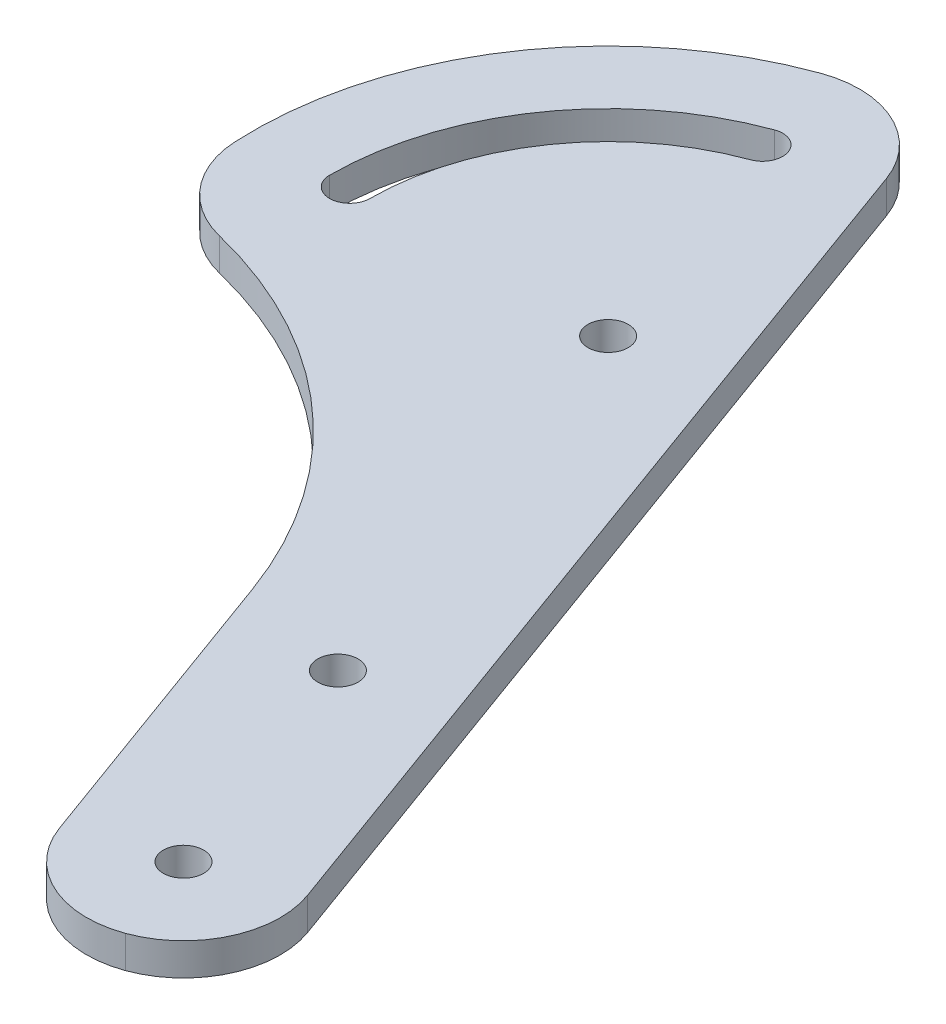
ISO-10303-21;
HEADER;
FILE_DESCRIPTION(('STEP AP214'),'2;1');
FILE_NAME('part.step','',(''),(''),'','','');
FILE_SCHEMA(('AUTOMOTIVE_DESIGN { 1 0 10303 214 1 1 1 1 }'));
ENDSEC;
DATA;
#1=APPLICATION_CONTEXT('core data for automotive mechanical design processes');
#2=APPLICATION_PROTOCOL_DEFINITION('international standard','automotive_design',2000,#1);
#3=PRODUCT_CONTEXT('',#1,'mechanical');
#4=PRODUCT('Part','Part','',(#3));
#5=PRODUCT_RELATED_PRODUCT_CATEGORY('part','',(#4));
#6=PRODUCT_DEFINITION_FORMATION('','',#4);
#7=PRODUCT_DEFINITION_CONTEXT('part definition',#1,'design');
#8=PRODUCT_DEFINITION('design','',#6,#7);
#9=PRODUCT_DEFINITION_SHAPE('','',#8);
#10=(LENGTH_UNIT() NAMED_UNIT(*) SI_UNIT(.MILLI.,.METRE.));
#11=(NAMED_UNIT(*) PLANE_ANGLE_UNIT() SI_UNIT($,.RADIAN.));
#12=(NAMED_UNIT(*) SI_UNIT($,.STERADIAN.) SOLID_ANGLE_UNIT());
#13=UNCERTAINTY_MEASURE_WITH_UNIT(LENGTH_MEASURE(1.E-05),#10,'distance_accuracy_value','');
#14=(GEOMETRIC_REPRESENTATION_CONTEXT(3) GLOBAL_UNCERTAINTY_ASSIGNED_CONTEXT((#13)) GLOBAL_UNIT_ASSIGNED_CONTEXT((#10,
#11,#12)) REPRESENTATION_CONTEXT('',''));
#15=CARTESIAN_POINT('',(0.,0.,0.));
#16=DIRECTION('',(0.,0.,1.));
#17=DIRECTION('',(1.,0.,0.));
#18=AXIS2_PLACEMENT_3D('',#15,#16,#17);
#19=CARTESIAN_POINT('',(152.4,6.35,-19.05));
#20=DIRECTION('',(0.,1.,0.));
#21=DIRECTION('',(0.,0.,1.));
#22=AXIS2_PLACEMENT_3D('',#19,#20,#21);
#23=PLANE('',#22);
#24=CARTESIAN_POINT('',(152.4,6.35,-19.05));
#25=DIRECTION('',(0.,1.,0.));
#26=DIRECTION('',(0.,0.,1.));
#27=AXIS2_PLACEMENT_3D('',#24,#25,#26);
#28=CIRCLE('',#27,3.96874999999999);
#29=CARTESIAN_POINT('',(152.4,6.35,-15.08125));
#30=VERTEX_POINT('',#29);
#31=EDGE_CURVE('E248',#30,#30,#28,.T.);
#32=ORIENTED_EDGE('',*,*,#31,.F.);
#33=EDGE_LOOP('',(#32));
#34=FACE_BOUND('',#33,.T.);
#35=CARTESIAN_POINT('',(182.805590741652,6.35,64.4886739878671));
#36=DIRECTION('',(0.,1.,0.));
#37=DIRECTION('',(0.,0.,1.));
#38=AXIS2_PLACEMENT_3D('',#35,#36,#37);
#39=CIRCLE('',#38,3.96874999999999);
#40=CARTESIAN_POINT('',(182.805590741652,6.35,68.4574239878671));
#41=VERTEX_POINT('',#40);
#42=EDGE_CURVE('E255',#41,#41,#39,.T.);
#43=ORIENTED_EDGE('',*,*,#42,.F.);
#44=EDGE_LOOP('',(#43));
#45=FACE_BOUND('',#44,.T.);
#46=CARTESIAN_POINT('',(200.180214022596,6.35,112.225059123791));
#47=DIRECTION('',(0.,1.,0.));
#48=DIRECTION('',(0.,0.,1.));
#49=AXIS2_PLACEMENT_3D('',#46,#47,#48);
#50=CIRCLE('',#49,3.96874999999999);
#51=CARTESIAN_POINT('',(200.180214022596,6.35,116.193809123791));
#52=VERTEX_POINT('',#51);
#53=EDGE_CURVE('E263',#52,#52,#50,.T.);
#54=ORIENTED_EDGE('',*,*,#53,.F.);
#55=EDGE_LOOP('',(#54));
#56=FACE_BOUND('',#55,.T.);
#57=DIRECTION('',(-0.342020143325673,0.,-0.939692620785907));
#58=VECTOR('',#57,1.);
#59=CARTESIAN_POINT('',(224.596842178922,6.35,123.610719819409));
#60=LINE('',#59,#58);
#61=CARTESIAN_POINT('',(218.081358448568,6.35,105.709575393437));
#62=VERTEX_POINT('',#61);
#63=CARTESIAN_POINT('',(152.926521145027,6.35,-73.3018688662781));
#64=VERTEX_POINT('',#63);
#65=EDGE_CURVE('E174',#62,#64,#60,.T.);
#66=ORIENTED_EDGE('',*,*,#65,.T.);
#67=CARTESIAN_POINT('',(135.025376719056,6.35,-66.7863851359241));
#68=DIRECTION('',(0.,1.,0.));
#69=DIRECTION('',(0.,0.,1.));
#70=AXIS2_PLACEMENT_3D('',#67,#68,#69);
#71=CIRCLE('',#70,19.05);
#72=CARTESIAN_POINT('',(128.509892988702,6.35,-84.6875295618957));
#73=VERTEX_POINT('',#72);
#74=EDGE_CURVE('E219',#64,#73,#71,.T.);
#75=ORIENTED_EDGE('',*,*,#74,.T.);
#76=CARTESIAN_POINT('',(152.4,6.35,-19.05));
#77=DIRECTION('',(0.,1.,0.));
#78=DIRECTION('',(0.,0.,1.));
#79=AXIS2_PLACEMENT_3D('',#76,#77,#78);
#80=CIRCLE('',#79,69.85);
#81=CARTESIAN_POINT('',(82.6455226381116,6.35,-15.3982349514504));
#82=VERTEX_POINT('',#81);
#83=EDGE_CURVE('E177',#73,#82,#80,.T.);
#84=ORIENTED_EDGE('',*,*,#83,.T.);
#85=CARTESIAN_POINT('',(101.669471009536,6.35,-16.3941708737821));
#86=DIRECTION('',(0.,1.,0.));
#87=DIRECTION('',(0.,0.,1.));
#88=AXIS2_PLACEMENT_3D('',#85,#86,#87);
#89=CIRCLE('',#88,19.05);
#90=CARTESIAN_POINT('',(97.1129181675343,6.35,2.10286473190478));
#91=VERTEX_POINT('',#90);
#92=EDGE_CURVE('E214',#82,#91,#89,.T.);
#93=ORIENTED_EDGE('',*,*,#92,.T.);
#94=CARTESIAN_POINT('',(75.4484422519158,6.35,90.0484227633844));
#95=DIRECTION('',(0.,-1.,0.));
#96=DIRECTION('',(0.,0.,-1.));
#97=AXIS2_PLACEMENT_3D('',#94,#95,#96);
#98=CIRCLE('',#97,90.5746691639929);
#99=CARTESIAN_POINT('',(160.560790495445,6.35,59.0700614342402));
#100=VERTEX_POINT('',#99);
#101=EDGE_CURVE('E181',#91,#100,#98,.T.);
#102=ORIENTED_EDGE('',*,*,#101,.T.);
#103=DIRECTION('',(0.342020143325673,0.,0.939692620785907));
#104=VECTOR('',#103,1.);
#105=CARTESIAN_POINT('',(160.560790495445,6.35,59.0700614342402));
#106=LINE('',#105,#104);
#107=CARTESIAN_POINT('',(182.279069596625,6.35,118.740542854145));
#108=VERTEX_POINT('',#107);
#109=EDGE_CURVE('E183',#100,#108,#106,.T.);
#110=ORIENTED_EDGE('',*,*,#109,.T.);
#111=CARTESIAN_POINT('',(200.180214022596,6.35,112.225059123791));
#112=DIRECTION('',(0.,1.,0.));
#113=DIRECTION('',(0.,0.,1.));
#114=AXIS2_PLACEMENT_3D('',#111,#112,#113);
#115=CIRCLE('',#114,19.05);
#116=CARTESIAN_POINT('',(206.695697752951,6.35,130.126203549763));
#117=VERTEX_POINT('',#116);
#118=EDGE_CURVE('E55',#108,#117,#115,.T.);
#119=ORIENTED_EDGE('',*,*,#118,.T.);
#120=CARTESIAN_POINT('',(200.180214022596,6.35,112.225059123791));
#121=DIRECTION('',(0.,1.,0.));
#122=DIRECTION('',(0.,0.,1.));
#123=AXIS2_PLACEMENT_3D('',#120,#121,#122);
#124=CIRCLE('',#123,19.05);
#125=EDGE_CURVE('E217',#117,#62,#124,.T.);
#126=ORIENTED_EDGE('',*,*,#125,.T.);
#127=EDGE_LOOP('',(#66,#75,#84,#93,#102,#110,#119,#126));
#128=FACE_BOUND('',#127,.T.);
#129=CARTESIAN_POINT('',(152.4,6.35,-19.05));
#130=DIRECTION('',(0.,-1.,0.));
#131=DIRECTION('',(0.,0.,-1.));
#132=AXIS2_PLACEMENT_3D('',#129,#130,#131);
#133=CIRCLE('',#132,46.83125);
#134=CARTESIAN_POINT('',(105.56875,6.35,-19.05));
#135=VERTEX_POINT('',#134);
#136=CARTESIAN_POINT('',(136.38276916288,6.35,-63.05698004718));
#137=VERTEX_POINT('',#136);
#138=EDGE_CURVE('E141',#135,#137,#133,.T.);
#139=ORIENTED_EDGE('',*,*,#138,.F.);
#140=CARTESIAN_POINT('',(101.6,6.35,-19.05));
#141=DIRECTION('',(0.,1.,0.));
#142=DIRECTION('',(0.,0.,-1.));
#143=AXIS2_PLACEMENT_3D('',#140,#141,#142);
#144=CIRCLE('',#143,3.96874999999999);
#145=CARTESIAN_POINT('',(97.63125,6.35,-19.05));
#146=VERTEX_POINT('',#145);
#147=EDGE_CURVE('E131',#146,#135,#144,.T.);
#148=ORIENTED_EDGE('',*,*,#147,.F.);
#149=CARTESIAN_POINT('',(152.4,6.35,-19.05));
#150=DIRECTION('',(0.,1.,0.));
#151=DIRECTION('',(0.,0.,-1.));
#152=AXIS2_PLACEMENT_3D('',#149,#150,#151);
#153=CIRCLE('',#152,54.76875);
#154=CARTESIAN_POINT('',(133.667984275232,6.35,-70.5157902246681));
#155=VERTEX_POINT('',#154);
#156=EDGE_CURVE('E156',#155,#146,#153,.T.);
#157=ORIENTED_EDGE('',*,*,#156,.F.);
#158=CARTESIAN_POINT('',(135.025376719056,6.35,-66.786385135924));
#159=DIRECTION('',(0.,1.,0.));
#160=DIRECTION('',(0.,0.,1.));
#161=AXIS2_PLACEMENT_3D('',#158,#159,#160);
#162=CIRCLE('',#161,3.96874999999999);
#163=EDGE_CURVE('E154',#137,#155,#162,.T.);
#164=ORIENTED_EDGE('',*,*,#163,.F.);
#165=EDGE_LOOP('',(#139,#148,#157,#164));
#166=FACE_BOUND('',#165,.T.);
#167=ADVANCED_FACE('F39',(#34,#45,#56,#128,#166),#23,.T.);
#168=CARTESIAN_POINT('',(152.4,0.,-19.05));
#169=DIRECTION('',(0.,1.,0.));
#170=DIRECTION('',(0.,0.,1.));
#171=AXIS2_PLACEMENT_3D('',#168,#169,#170);
#172=PLANE('',#171);
#173=CARTESIAN_POINT('',(152.4,0.,-19.05));
#174=DIRECTION('',(0.,1.,0.));
#175=DIRECTION('',(0.,0.,1.));
#176=AXIS2_PLACEMENT_3D('',#173,#174,#175);
#177=CIRCLE('',#176,3.96874999999999);
#178=CARTESIAN_POINT('',(152.4,0.,-15.08125));
#179=VERTEX_POINT('',#178);
#180=EDGE_CURVE('E250',#179,#179,#177,.T.);
#181=ORIENTED_EDGE('',*,*,#180,.T.);
#182=EDGE_LOOP('',(#181));
#183=FACE_BOUND('',#182,.T.);
#184=CARTESIAN_POINT('',(182.805590741652,0.,64.4886739878671));
#185=DIRECTION('',(0.,1.,0.));
#186=DIRECTION('',(0.,0.,1.));
#187=AXIS2_PLACEMENT_3D('',#184,#185,#186);
#188=CIRCLE('',#187,3.96874999999999);
#189=CARTESIAN_POINT('',(182.805590741652,0.,68.4574239878671));
#190=VERTEX_POINT('',#189);
#191=EDGE_CURVE('E260',#190,#190,#188,.T.);
#192=ORIENTED_EDGE('',*,*,#191,.T.);
#193=EDGE_LOOP('',(#192));
#194=FACE_BOUND('',#193,.T.);
#195=CARTESIAN_POINT('',(200.180214022596,0.,112.225059123791));
#196=DIRECTION('',(0.,1.,0.));
#197=DIRECTION('',(0.,0.,1.));
#198=AXIS2_PLACEMENT_3D('',#195,#196,#197);
#199=CIRCLE('',#198,3.96874999999999);
#200=CARTESIAN_POINT('',(200.180214022596,0.,116.193809123791));
#201=VERTEX_POINT('',#200);
#202=EDGE_CURVE('E163',#201,#201,#199,.T.);
#203=ORIENTED_EDGE('',*,*,#202,.T.);
#204=EDGE_LOOP('',(#203));
#205=FACE_BOUND('',#204,.T.);
#206=CARTESIAN_POINT('',(152.4,0.,-19.05));
#207=DIRECTION('',(0.,1.,0.));
#208=DIRECTION('',(0.,0.,1.));
#209=AXIS2_PLACEMENT_3D('',#206,#207,#208);
#210=CIRCLE('',#209,69.85);
#211=CARTESIAN_POINT('',(128.509892988702,0.,-84.6875295618957));
#212=VERTEX_POINT('',#211);
#213=CARTESIAN_POINT('',(82.6455226381116,0.,-15.3982349514504));
#214=VERTEX_POINT('',#213);
#215=EDGE_CURVE('E188',#212,#214,#210,.T.);
#216=ORIENTED_EDGE('',*,*,#215,.F.);
#217=CARTESIAN_POINT('',(135.025376719056,0.,-66.7863851359241));
#218=DIRECTION('',(0.,1.,0.));
#219=DIRECTION('',(0.,0.,1.));
#220=AXIS2_PLACEMENT_3D('',#217,#218,#219);
#221=CIRCLE('',#220,19.05);
#222=CARTESIAN_POINT('',(152.926521145027,0.,-73.3018688662782));
#223=VERTEX_POINT('',#222);
#224=EDGE_CURVE('E207',#212,#223,#221,.F.);
#225=ORIENTED_EDGE('',*,*,#224,.T.);
#226=DIRECTION('',(-0.342020143325672,0.,-0.939692620785907));
#227=VECTOR('',#226,1.);
#228=CARTESIAN_POINT('',(196.363079347388,0.,46.039093973532));
#229=LINE('',#228,#227);
#230=CARTESIAN_POINT('',(218.081358448568,0.,105.709575393437));
#231=VERTEX_POINT('',#230);
#232=EDGE_CURVE('E149',#231,#223,#229,.T.);
#233=ORIENTED_EDGE('',*,*,#232,.F.);
#234=CARTESIAN_POINT('',(200.180214022596,0.,112.225059123791));
#235=DIRECTION('',(0.,1.,0.));
#236=DIRECTION('',(0.,0.,1.));
#237=AXIS2_PLACEMENT_3D('',#234,#235,#236);
#238=CIRCLE('',#237,19.05);
#239=CARTESIAN_POINT('',(206.695697752951,0.,130.126203549763));
#240=VERTEX_POINT('',#239);
#241=EDGE_CURVE('E205',#231,#240,#238,.F.);
#242=ORIENTED_EDGE('',*,*,#241,.T.);
#243=CARTESIAN_POINT('',(200.180214022596,0.,112.225059123791));
#244=DIRECTION('',(0.,1.,0.));
#245=DIRECTION('',(0.,0.,1.));
#246=AXIS2_PLACEMENT_3D('',#243,#244,#245);
#247=CIRCLE('',#246,19.05);
#248=CARTESIAN_POINT('',(182.279069596625,0.,118.740542854145));
#249=VERTEX_POINT('',#248);
#250=EDGE_CURVE('E203',#240,#249,#247,.F.);
#251=ORIENTED_EDGE('',*,*,#250,.T.);
#252=DIRECTION('',(0.342020143325673,0.,0.939692620785907));
#253=VECTOR('',#252,1.);
#254=CARTESIAN_POINT('',(160.560790495445,0.,59.0700614342402));
#255=LINE('',#254,#253);
#256=CARTESIAN_POINT('',(160.560790495445,0.,59.0700614342402));
#257=VERTEX_POINT('',#256);
#258=EDGE_CURVE('E178',#257,#249,#255,.T.);
#259=ORIENTED_EDGE('',*,*,#258,.F.);
#260=CARTESIAN_POINT('',(75.4484422519158,0.,90.0484227633844));
#261=DIRECTION('',(0.,-1.,0.));
#262=DIRECTION('',(0.,0.,-1.));
#263=AXIS2_PLACEMENT_3D('',#260,#261,#262);
#264=CIRCLE('',#263,90.5746691639929);
#265=CARTESIAN_POINT('',(97.1129181675343,0.,2.10286473190478));
#266=VERTEX_POINT('',#265);
#267=EDGE_CURVE('E191',#266,#257,#264,.T.);
#268=ORIENTED_EDGE('',*,*,#267,.F.);
#269=CARTESIAN_POINT('',(101.669471009536,0.,-16.3941708737821));
#270=DIRECTION('',(0.,1.,0.));
#271=DIRECTION('',(0.,0.,1.));
#272=AXIS2_PLACEMENT_3D('',#269,#270,#271);
#273=CIRCLE('',#272,19.05);
#274=EDGE_CURVE('E201',#266,#214,#273,.F.);
#275=ORIENTED_EDGE('',*,*,#274,.T.);
#276=EDGE_LOOP('',(#216,#225,#233,#242,#251,#259,#268,#275));
#277=FACE_BOUND('',#276,.T.);
#278=CARTESIAN_POINT('',(101.6,0.,-19.05));
#279=DIRECTION('',(0.,1.,0.));
#280=DIRECTION('',(0.,0.,-1.));
#281=AXIS2_PLACEMENT_3D('',#278,#279,#280);
#282=CIRCLE('',#281,3.96874999999999);
#283=CARTESIAN_POINT('',(97.63125,0.,-19.05));
#284=VERTEX_POINT('',#283);
#285=CARTESIAN_POINT('',(105.56875,0.,-19.05));
#286=VERTEX_POINT('',#285);
#287=EDGE_CURVE('E161',#284,#286,#282,.T.);
#288=ORIENTED_EDGE('',*,*,#287,.T.);
#289=CARTESIAN_POINT('',(152.4,0.,-19.05));
#290=DIRECTION('',(0.,-1.,0.));
#291=DIRECTION('',(0.,0.,-1.));
#292=AXIS2_PLACEMENT_3D('',#289,#290,#291);
#293=CIRCLE('',#292,46.83125);
#294=CARTESIAN_POINT('',(136.38276916288,0.,-63.05698004718));
#295=VERTEX_POINT('',#294);
#296=EDGE_CURVE('E148',#286,#295,#293,.T.);
#297=ORIENTED_EDGE('',*,*,#296,.T.);
#298=CARTESIAN_POINT('',(135.025376719056,0.,-66.786385135924));
#299=DIRECTION('',(0.,1.,0.));
#300=DIRECTION('',(0.,0.,1.));
#301=AXIS2_PLACEMENT_3D('',#298,#299,#300);
#302=CIRCLE('',#301,3.96874999999999);
#303=CARTESIAN_POINT('',(133.667984275232,0.,-70.5157902246681));
#304=VERTEX_POINT('',#303);
#305=EDGE_CURVE('E165',#295,#304,#302,.T.);
#306=ORIENTED_EDGE('',*,*,#305,.T.);
#307=CARTESIAN_POINT('',(152.4,0.,-19.05));
#308=DIRECTION('',(0.,1.,0.));
#309=DIRECTION('',(0.,0.,-1.));
#310=AXIS2_PLACEMENT_3D('',#307,#308,#309);
#311=CIRCLE('',#310,54.76875);
#312=EDGE_CURVE('E142',#304,#284,#311,.T.);
#313=ORIENTED_EDGE('',*,*,#312,.T.);
#314=EDGE_LOOP('',(#288,#297,#306,#313));
#315=FACE_BOUND('',#314,.T.);
#316=ADVANCED_FACE('F235',(#183,#194,#205,#277,#315),#172,.F.);
#317=CARTESIAN_POINT('',(196.363079347388,6.35,46.039093973532));
#318=DIRECTION('',(-0.939692620785907,0.,0.342020143325672));
#319=DIRECTION('',(0.342020143325672,0.,0.939692620785907));
#320=AXIS2_PLACEMENT_3D('',#317,#318,#319);
#321=PLANE('',#320);
#322=ORIENTED_EDGE('',*,*,#232,.T.);
#323=DIRECTION('',(0.,-1.,0.));
#324=VECTOR('',#323,1.);
#325=CARTESIAN_POINT('',(152.926521145027,6.35,-73.3018688662782));
#326=LINE('',#325,#324);
#327=EDGE_CURVE('E212',#223,#64,#326,.F.);
#328=ORIENTED_EDGE('',*,*,#327,.T.);
#329=ORIENTED_EDGE('',*,*,#65,.F.);
#330=DIRECTION('',(0.,-1.,0.));
#331=VECTOR('',#330,1.);
#332=CARTESIAN_POINT('',(218.081358448568,6.35,105.709575393437));
#333=LINE('',#332,#331);
#334=EDGE_CURVE('E209',#62,#231,#333,.T.);
#335=ORIENTED_EDGE('',*,*,#334,.T.);
#336=EDGE_LOOP('',(#322,#328,#329,#335));
#337=FACE_BOUND('',#336,.T.);
#338=ADVANCED_FACE('F238',(#337),#321,.F.);
#339=CARTESIAN_POINT('',(152.4,6.35,-19.05));
#340=DIRECTION('',(0.,-1.,0.));
#341=DIRECTION('',(0.,0.,-1.));
#342=AXIS2_PLACEMENT_3D('',#339,#340,#341);
#343=CYLINDRICAL_SURFACE('',#342,69.85);
#344=ORIENTED_EDGE('',*,*,#83,.F.);
#345=DIRECTION('',(0.,-1.,0.));
#346=VECTOR('',#345,1.);
#347=CARTESIAN_POINT('',(128.509892988702,6.35,-84.6875295618957));
#348=LINE('',#347,#346);
#349=EDGE_CURVE('E198',#73,#212,#348,.T.);
#350=ORIENTED_EDGE('',*,*,#349,.T.);
#351=ORIENTED_EDGE('',*,*,#215,.T.);
#352=DIRECTION('',(0.,-1.,0.));
#353=VECTOR('',#352,1.);
#354=CARTESIAN_POINT('',(82.6455226381116,6.35,-15.3982349514504));
#355=LINE('',#354,#353);
#356=EDGE_CURVE('E196',#214,#82,#355,.F.);
#357=ORIENTED_EDGE('',*,*,#356,.T.);
#358=EDGE_LOOP('',(#344,#350,#351,#357));
#359=FACE_BOUND('',#358,.T.);
#360=ADVANCED_FACE('F229',(#359),#343,.T.);
#361=CARTESIAN_POINT('',(75.4484422519158,6.35,90.0484227633844));
#362=DIRECTION('',(0.,-1.,0.));
#363=DIRECTION('',(0.,0.,-1.));
#364=AXIS2_PLACEMENT_3D('',#361,#362,#363);
#365=CYLINDRICAL_SURFACE('',#364,90.5746691639929);
#366=ORIENTED_EDGE('',*,*,#101,.F.);
#367=DIRECTION('',(0.,-1.,0.));
#368=VECTOR('',#367,1.);
#369=CARTESIAN_POINT('',(97.1129181675343,6.35,2.10286473190478));
#370=LINE('',#369,#368);
#371=EDGE_CURVE('E11',#91,#266,#370,.T.);
#372=ORIENTED_EDGE('',*,*,#371,.T.);
#373=ORIENTED_EDGE('',*,*,#267,.T.);
#374=DIRECTION('',(0.,-1.,0.));
#375=VECTOR('',#374,1.);
#376=CARTESIAN_POINT('',(160.560790495445,6.35,59.0700614342402));
#377=LINE('',#376,#375);
#378=EDGE_CURVE('E185',#100,#257,#377,.T.);
#379=ORIENTED_EDGE('',*,*,#378,.F.);
#380=EDGE_LOOP('',(#366,#372,#373,#379));
#381=FACE_BOUND('',#380,.T.);
#382=ADVANCED_FACE('F292',(#381),#365,.F.);
#383=CARTESIAN_POINT('',(160.560790495445,6.35,59.0700614342402));
#384=DIRECTION('',(0.939692620785907,0.,-0.342020143325673));
#385=DIRECTION('',(-0.342020143325673,0.,-0.939692620785907));
#386=AXIS2_PLACEMENT_3D('',#383,#384,#385);
#387=PLANE('',#386);
#388=ORIENTED_EDGE('',*,*,#258,.T.);
#389=DIRECTION('',(0.,-1.,0.));
#390=VECTOR('',#389,1.);
#391=CARTESIAN_POINT('',(182.279069596625,6.35,118.740542854145));
#392=LINE('',#391,#390);
#393=EDGE_CURVE('E48',#249,#108,#392,.F.);
#394=ORIENTED_EDGE('',*,*,#393,.T.);
#395=ORIENTED_EDGE('',*,*,#109,.F.);
#396=ORIENTED_EDGE('',*,*,#378,.T.);
#397=EDGE_LOOP('',(#388,#394,#395,#396));
#398=FACE_BOUND('',#397,.T.);
#399=ADVANCED_FACE('F289',(#398),#387,.F.);
#400=CARTESIAN_POINT('',(101.6,6.35,-19.05));
#401=DIRECTION('',(0.,-1.,0.));
#402=DIRECTION('',(0.,0.,-1.));
#403=AXIS2_PLACEMENT_3D('',#400,#401,#402);
#404=CYLINDRICAL_SURFACE('',#403,3.96874999999999);
#405=ORIENTED_EDGE('',*,*,#287,.F.);
#406=DIRECTION('',(0.,-1.,0.));
#407=VECTOR('',#406,1.);
#408=CARTESIAN_POINT('',(97.63125,6.35,-19.05));
#409=LINE('',#408,#407);
#410=EDGE_CURVE('E137',#146,#284,#409,.T.);
#411=ORIENTED_EDGE('',*,*,#410,.F.);
#412=ORIENTED_EDGE('',*,*,#147,.T.);
#413=DIRECTION('',(0.,-1.,0.));
#414=VECTOR('',#413,1.);
#415=CARTESIAN_POINT('',(105.56875,6.35,-19.05));
#416=LINE('',#415,#414);
#417=EDGE_CURVE('E134',#135,#286,#416,.T.);
#418=ORIENTED_EDGE('',*,*,#417,.T.);
#419=EDGE_LOOP('',(#405,#411,#412,#418));
#420=FACE_BOUND('',#419,.T.);
#421=ADVANCED_FACE('F133',(#420),#404,.F.);
#422=CARTESIAN_POINT('',(152.4,6.35,-19.05));
#423=DIRECTION('',(0.,-1.,0.));
#424=DIRECTION('',(0.,0.,-1.));
#425=AXIS2_PLACEMENT_3D('',#422,#423,#424);
#426=CYLINDRICAL_SURFACE('',#425,46.83125);
#427=ORIENTED_EDGE('',*,*,#296,.F.);
#428=ORIENTED_EDGE('',*,*,#417,.F.);
#429=ORIENTED_EDGE('',*,*,#138,.T.);
#430=DIRECTION('',(0.,-1.,0.));
#431=VECTOR('',#430,1.);
#432=CARTESIAN_POINT('',(136.38276916288,6.35,-63.05698004718));
#433=LINE('',#432,#431);
#434=EDGE_CURVE('E150',#137,#295,#433,.T.);
#435=ORIENTED_EDGE('',*,*,#434,.T.);
#436=EDGE_LOOP('',(#427,#428,#429,#435));
#437=FACE_BOUND('',#436,.T.);
#438=ADVANCED_FACE('F145',(#437),#426,.T.);
#439=CARTESIAN_POINT('',(135.025376719056,6.35,-66.786385135924));
#440=DIRECTION('',(0.,-1.,0.));
#441=DIRECTION('',(0.,0.,-1.));
#442=AXIS2_PLACEMENT_3D('',#439,#440,#441);
#443=CYLINDRICAL_SURFACE('',#442,3.96874999999999);
#444=ORIENTED_EDGE('',*,*,#305,.F.);
#445=ORIENTED_EDGE('',*,*,#434,.F.);
#446=ORIENTED_EDGE('',*,*,#163,.T.);
#447=DIRECTION('',(0.,-1.,0.));
#448=VECTOR('',#447,1.);
#449=CARTESIAN_POINT('',(133.667984275232,6.35,-70.5157902246681));
#450=LINE('',#449,#448);
#451=EDGE_CURVE('E171',#155,#304,#450,.T.);
#452=ORIENTED_EDGE('',*,*,#451,.T.);
#453=EDGE_LOOP('',(#444,#445,#446,#452));
#454=FACE_BOUND('',#453,.T.);
#455=ADVANCED_FACE('F359',(#454),#443,.F.);
#456=CARTESIAN_POINT('',(152.4,6.35,-19.05));
#457=DIRECTION('',(0.,-1.,0.));
#458=DIRECTION('',(0.,0.,-1.));
#459=AXIS2_PLACEMENT_3D('',#456,#457,#458);
#460=CYLINDRICAL_SURFACE('',#459,54.76875);
#461=ORIENTED_EDGE('',*,*,#312,.F.);
#462=ORIENTED_EDGE('',*,*,#451,.F.);
#463=ORIENTED_EDGE('',*,*,#156,.T.);
#464=ORIENTED_EDGE('',*,*,#410,.T.);
#465=EDGE_LOOP('',(#461,#462,#463,#464));
#466=FACE_BOUND('',#465,.T.);
#467=ADVANCED_FACE('F273',(#466),#460,.F.);
#468=CARTESIAN_POINT('',(200.180214022596,6.35,112.225059123791));
#469=DIRECTION('',(0.,1.,0.));
#470=DIRECTION('',(0.,0.,1.));
#471=AXIS2_PLACEMENT_3D('',#468,#469,#470);
#472=CYLINDRICAL_SURFACE('',#471,3.96874999999999);
#473=ORIENTED_EDGE('',*,*,#202,.F.);
#474=EDGE_LOOP('',(#473));
#475=FACE_BOUND('',#474,.T.);
#476=ORIENTED_EDGE('',*,*,#53,.T.);
#477=EDGE_LOOP('',(#476));
#478=FACE_BOUND('',#477,.T.);
#479=ADVANCED_FACE('F269',(#475,#478),#472,.F.);
#480=CARTESIAN_POINT('',(182.805590741652,6.35,64.4886739878671));
#481=DIRECTION('',(0.,1.,0.));
#482=DIRECTION('',(0.,0.,1.));
#483=AXIS2_PLACEMENT_3D('',#480,#481,#482);
#484=CYLINDRICAL_SURFACE('',#483,3.96874999999999);
#485=ORIENTED_EDGE('',*,*,#191,.F.);
#486=EDGE_LOOP('',(#485));
#487=FACE_BOUND('',#486,.T.);
#488=ORIENTED_EDGE('',*,*,#42,.T.);
#489=EDGE_LOOP('',(#488));
#490=FACE_BOUND('',#489,.T.);
#491=ADVANCED_FACE('F272',(#487,#490),#484,.F.);
#492=CARTESIAN_POINT('',(152.4,6.35,-19.05));
#493=DIRECTION('',(0.,1.,0.));
#494=DIRECTION('',(0.,0.,1.));
#495=AXIS2_PLACEMENT_3D('',#492,#493,#494);
#496=CYLINDRICAL_SURFACE('',#495,3.96874999999999);
#497=ORIENTED_EDGE('',*,*,#180,.F.);
#498=EDGE_LOOP('',(#497));
#499=FACE_BOUND('',#498,.T.);
#500=ORIENTED_EDGE('',*,*,#31,.T.);
#501=EDGE_LOOP('',(#500));
#502=FACE_BOUND('',#501,.T.);
#503=ADVANCED_FACE('F302',(#499,#502),#496,.F.);
#504=CARTESIAN_POINT('',(135.025376719056,6.35,-66.7863851359241));
#505=DIRECTION('',(0.,-1.,0.));
#506=DIRECTION('',(0.,0.,-1.));
#507=AXIS2_PLACEMENT_3D('',#504,#505,#506);
#508=CYLINDRICAL_SURFACE('',#507,19.05);
#509=ORIENTED_EDGE('',*,*,#74,.F.);
#510=ORIENTED_EDGE('',*,*,#327,.F.);
#511=ORIENTED_EDGE('',*,*,#224,.F.);
#512=ORIENTED_EDGE('',*,*,#349,.F.);
#513=EDGE_LOOP('',(#509,#510,#511,#512));
#514=FACE_BOUND('',#513,.T.);
#515=ADVANCED_FACE('F232',(#514),#508,.T.);
#516=CARTESIAN_POINT('',(200.180214022596,6.35,112.225059123791));
#517=DIRECTION('',(0.,-1.,0.));
#518=DIRECTION('',(0.,0.,-1.));
#519=AXIS2_PLACEMENT_3D('',#516,#517,#518);
#520=CYLINDRICAL_SURFACE('',#519,19.05);
#521=DIRECTION('',(0.,-1.,0.));
#522=VECTOR('',#521,1.);
#523=CARTESIAN_POINT('',(206.695697752951,6.35,130.126203549763));
#524=LINE('',#523,#522);
#525=EDGE_CURVE('E43',#117,#240,#524,.T.);
#526=ORIENTED_EDGE('',*,*,#525,.F.);
#527=ORIENTED_EDGE('',*,*,#118,.F.);
#528=ORIENTED_EDGE('',*,*,#393,.F.);
#529=ORIENTED_EDGE('',*,*,#250,.F.);
#530=EDGE_LOOP('',(#526,#527,#528,#529));
#531=FACE_BOUND('',#530,.T.);
#532=ADVANCED_FACE('F247',(#531),#520,.T.);
#533=CARTESIAN_POINT('',(200.180214022596,6.35,112.225059123791));
#534=DIRECTION('',(0.,-1.,0.));
#535=DIRECTION('',(0.,0.,-1.));
#536=AXIS2_PLACEMENT_3D('',#533,#534,#535);
#537=CYLINDRICAL_SURFACE('',#536,19.05);
#538=ORIENTED_EDGE('',*,*,#125,.F.);
#539=ORIENTED_EDGE('',*,*,#525,.T.);
#540=ORIENTED_EDGE('',*,*,#241,.F.);
#541=ORIENTED_EDGE('',*,*,#334,.F.);
#542=EDGE_LOOP('',(#538,#539,#540,#541));
#543=FACE_BOUND('',#542,.T.);
#544=ADVANCED_FACE('F242',(#543),#537,.T.);
#545=CARTESIAN_POINT('',(101.669471009536,6.35,-16.3941708737821));
#546=DIRECTION('',(0.,1.,0.));
#547=DIRECTION('',(0.,0.,1.));
#548=AXIS2_PLACEMENT_3D('',#545,#546,#547);
#549=CYLINDRICAL_SURFACE('',#548,19.05);
#550=ORIENTED_EDGE('',*,*,#92,.F.);
#551=ORIENTED_EDGE('',*,*,#356,.F.);
#552=ORIENTED_EDGE('',*,*,#274,.F.);
#553=ORIENTED_EDGE('',*,*,#371,.F.);
#554=EDGE_LOOP('',(#550,#551,#552,#553));
#555=FACE_BOUND('',#554,.T.);
#556=ADVANCED_FACE('F41',(#555),#549,.T.);
#557=CLOSED_SHELL('',(#167,#316,#338,#360,#382,#399,#421,#438,#455,#467,#479,#491,#503,#515,
#532,#544,#556));
#558=MANIFOLD_SOLID_BREP('B2',#557);
#559=ADVANCED_BREP_SHAPE_REPRESENTATION('',(#18,#558),#14);
#560=SHAPE_DEFINITION_REPRESENTATION(#9,#559);
ENDSEC;
END-ISO-10303-21;
